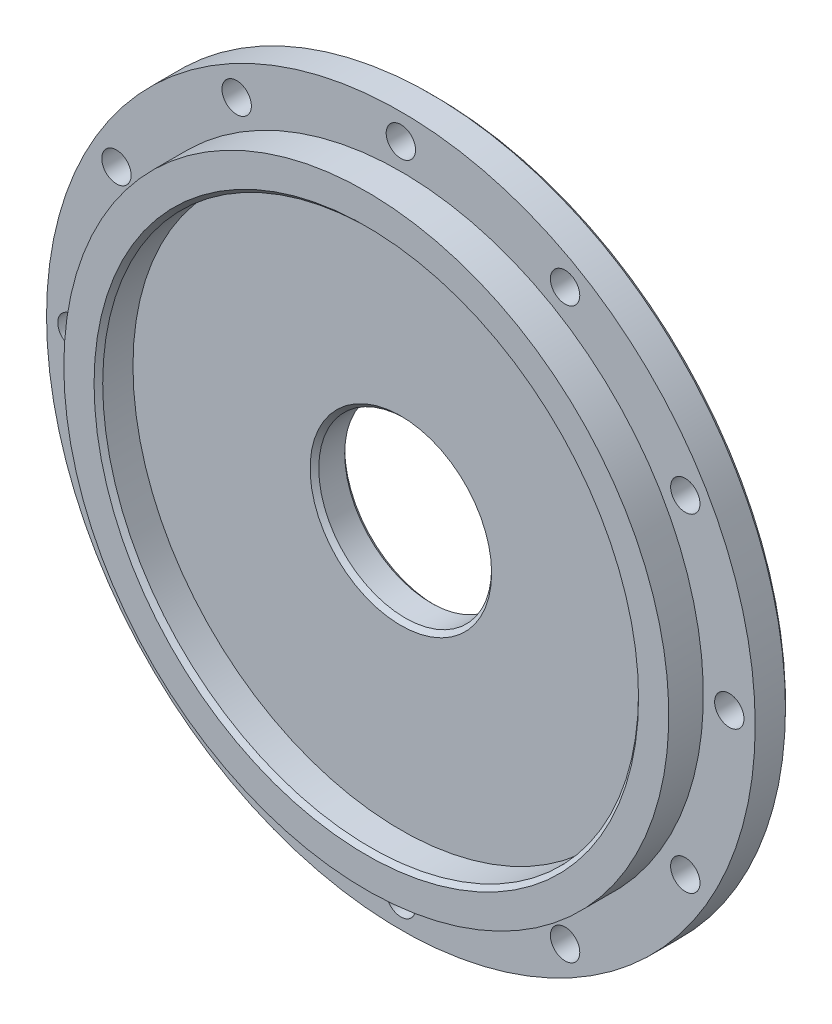
ISO-10303-21;
HEADER;
FILE_DESCRIPTION(('STEP AP214'),'2;1');
FILE_NAME('part.step','',(''),(''),'','','');
FILE_SCHEMA(('AUTOMOTIVE_DESIGN { 1 0 10303 214 1 1 1 1 }'));
ENDSEC;
DATA;
#1=APPLICATION_CONTEXT('core data for automotive mechanical design processes');
#2=APPLICATION_PROTOCOL_DEFINITION('international standard','automotive_design',2000,#1);
#3=PRODUCT_CONTEXT('',#1,'mechanical');
#4=PRODUCT('Part','Part','',(#3));
#5=PRODUCT_RELATED_PRODUCT_CATEGORY('part','',(#4));
#6=PRODUCT_DEFINITION_FORMATION('','',#4);
#7=PRODUCT_DEFINITION_CONTEXT('part definition',#1,'design');
#8=PRODUCT_DEFINITION('design','',#6,#7);
#9=PRODUCT_DEFINITION_SHAPE('','',#8);
#10=(LENGTH_UNIT() NAMED_UNIT(*) SI_UNIT(.MILLI.,.METRE.));
#11=(NAMED_UNIT(*) PLANE_ANGLE_UNIT() SI_UNIT($,.RADIAN.));
#12=(NAMED_UNIT(*) SI_UNIT($,.STERADIAN.) SOLID_ANGLE_UNIT());
#13=UNCERTAINTY_MEASURE_WITH_UNIT(LENGTH_MEASURE(1.E-05),#10,'distance_accuracy_value','');
#14=(GEOMETRIC_REPRESENTATION_CONTEXT(3) GLOBAL_UNCERTAINTY_ASSIGNED_CONTEXT((#13)) GLOBAL_UNIT_ASSIGNED_CONTEXT((#10,
#11,#12)) REPRESENTATION_CONTEXT('',''));
#15=CARTESIAN_POINT('',(0.,0.,0.));
#16=DIRECTION('',(0.,0.,1.));
#17=DIRECTION('',(1.,0.,0.));
#18=AXIS2_PLACEMENT_3D('',#15,#16,#17);
#19=CARTESIAN_POINT('',(0.,0.,0.));
#20=DIRECTION('',(0.,0.,-1.));
#21=DIRECTION('',(-1.,0.,0.));
#22=AXIS2_PLACEMENT_3D('',#19,#20,#21);
#23=PLANE('',#22);
#24=CARTESIAN_POINT('',(0.,0.,0.));
#25=DIRECTION('',(0.,0.,-1.));
#26=DIRECTION('',(-1.,0.,0.));
#27=AXIS2_PLACEMENT_3D('',#24,#25,#26);
#28=CIRCLE('',#27,10.5);
#29=CARTESIAN_POINT('',(-10.5,0.,0.));
#30=VERTEX_POINT('',#29);
#31=EDGE_CURVE('E61',#30,#30,#28,.F.);
#32=ORIENTED_EDGE('',*,*,#31,.T.);
#33=EDGE_LOOP('',(#32));
#34=FACE_BOUND('',#33,.T.);
#35=CARTESIAN_POINT('',(0.,0.,0.));
#36=DIRECTION('',(0.,0.,-1.));
#37=DIRECTION('',(-1.,0.,0.));
#38=AXIS2_PLACEMENT_3D('',#35,#36,#37);
#39=CIRCLE('',#38,40.5);
#40=CARTESIAN_POINT('',(-40.5,0.,0.));
#41=VERTEX_POINT('',#40);
#42=EDGE_CURVE('E62',#41,#41,#39,.T.);
#43=ORIENTED_EDGE('',*,*,#42,.T.);
#44=EDGE_LOOP('',(#43));
#45=FACE_BOUND('',#44,.T.);
#46=CARTESIAN_POINT('',(0.,38.,0.));
#47=DIRECTION('',(0.,0.,-1.));
#48=DIRECTION('',(-1.,0.,0.));
#49=AXIS2_PLACEMENT_3D('',#46,#47,#48);
#50=CIRCLE('',#49,1.7);
#51=CARTESIAN_POINT('',(-1.7,38.,0.));
#52=VERTEX_POINT('',#51);
#53=EDGE_CURVE('E115',#52,#52,#50,.F.);
#54=ORIENTED_EDGE('',*,*,#53,.T.);
#55=EDGE_LOOP('',(#54));
#56=FACE_BOUND('',#55,.T.);
#57=CARTESIAN_POINT('',(-18.9999999999996,32.9089653438089,0.));
#58=DIRECTION('',(0.,0.,-1.));
#59=DIRECTION('',(-1.,0.,0.));
#60=AXIS2_PLACEMENT_3D('',#57,#58,#59);
#61=CIRCLE('',#60,1.7);
#62=CARTESIAN_POINT('',(-20.6999999999996,32.9089653438089,0.));
#63=VERTEX_POINT('',#62);
#64=EDGE_CURVE('E140',#63,#63,#61,.F.);
#65=ORIENTED_EDGE('',*,*,#64,.T.);
#66=EDGE_LOOP('',(#65));
#67=FACE_BOUND('',#66,.T.);
#68=CARTESIAN_POINT('',(-32.9089653438084,19.0000000000004,0.));
#69=DIRECTION('',(0.,0.,-1.));
#70=DIRECTION('',(-1.,0.,0.));
#71=AXIS2_PLACEMENT_3D('',#68,#69,#70);
#72=CIRCLE('',#71,1.7);
#73=CARTESIAN_POINT('',(-34.6089653438084,19.0000000000004,0.));
#74=VERTEX_POINT('',#73);
#75=EDGE_CURVE('E148',#74,#74,#72,.F.);
#76=ORIENTED_EDGE('',*,*,#75,.T.);
#77=EDGE_LOOP('',(#76));
#78=FACE_BOUND('',#77,.T.);
#79=CARTESIAN_POINT('',(-38.,3.98028872628117E-13,0.));
#80=DIRECTION('',(0.,0.,-1.));
#81=DIRECTION('',(-1.,0.,0.));
#82=AXIS2_PLACEMENT_3D('',#79,#80,#81);
#83=CIRCLE('',#82,1.7);
#84=CARTESIAN_POINT('',(-39.7,3.98028872628117E-13,0.));
#85=VERTEX_POINT('',#84);
#86=EDGE_CURVE('E116',#85,#85,#83,.F.);
#87=ORIENTED_EDGE('',*,*,#86,.T.);
#88=EDGE_LOOP('',(#87));
#89=FACE_BOUND('',#88,.T.);
#90=CARTESIAN_POINT('',(19.,32.9089653438087,0.));
#91=DIRECTION('',(0.,0.,-1.));
#92=DIRECTION('',(-1.,0.,0.));
#93=AXIS2_PLACEMENT_3D('',#90,#91,#92);
#94=CIRCLE('',#93,1.7);
#95=CARTESIAN_POINT('',(17.3,32.9089653438087,0.));
#96=VERTEX_POINT('',#95);
#97=EDGE_CURVE('E108',#96,#96,#94,.F.);
#98=ORIENTED_EDGE('',*,*,#97,.T.);
#99=EDGE_LOOP('',(#98));
#100=FACE_BOUND('',#99,.T.);
#101=CARTESIAN_POINT('',(32.9089653438087,18.9999999999999,0.));
#102=DIRECTION('',(0.,0.,-1.));
#103=DIRECTION('',(-1.,0.,0.));
#104=AXIS2_PLACEMENT_3D('',#101,#102,#103);
#105=CIRCLE('',#104,1.70000000000001);
#106=CARTESIAN_POINT('',(31.2089653438087,18.9999999999999,0.));
#107=VERTEX_POINT('',#106);
#108=EDGE_CURVE('E103',#107,#107,#105,.F.);
#109=ORIENTED_EDGE('',*,*,#108,.T.);
#110=EDGE_LOOP('',(#109));
#111=FACE_BOUND('',#110,.T.);
#112=CARTESIAN_POINT('',(38.,-1.32676290876039E-13,0.));
#113=DIRECTION('',(0.,0.,-1.));
#114=DIRECTION('',(-1.,0.,0.));
#115=AXIS2_PLACEMENT_3D('',#112,#113,#114);
#116=CIRCLE('',#115,1.7);
#117=CARTESIAN_POINT('',(36.3,-1.32676290876039E-13,0.));
#118=VERTEX_POINT('',#117);
#119=EDGE_CURVE('E100',#118,#118,#116,.F.);
#120=ORIENTED_EDGE('',*,*,#119,.T.);
#121=EDGE_LOOP('',(#120));
#122=FACE_BOUND('',#121,.T.);
#123=CARTESIAN_POINT('',(32.9089653438086,-19.0000000000002,0.));
#124=DIRECTION('',(0.,0.,-1.));
#125=DIRECTION('',(-1.,0.,0.));
#126=AXIS2_PLACEMENT_3D('',#123,#124,#125);
#127=CIRCLE('',#126,1.7);
#128=CARTESIAN_POINT('',(31.2089653438086,-19.0000000000002,0.));
#129=VERTEX_POINT('',#128);
#130=EDGE_CURVE('E89',#129,#129,#127,.F.);
#131=ORIENTED_EDGE('',*,*,#130,.T.);
#132=EDGE_LOOP('',(#131));
#133=FACE_BOUND('',#132,.T.);
#134=CARTESIAN_POINT('',(18.9999999999998,-32.9089653438088,0.));
#135=DIRECTION('',(0.,0.,-1.));
#136=DIRECTION('',(-1.,0.,0.));
#137=AXIS2_PLACEMENT_3D('',#134,#135,#136);
#138=CIRCLE('',#137,1.7);
#139=CARTESIAN_POINT('',(17.2999999999998,-32.9089653438088,0.));
#140=VERTEX_POINT('',#139);
#141=EDGE_CURVE('E93',#140,#140,#138,.F.);
#142=ORIENTED_EDGE('',*,*,#141,.T.);
#143=EDGE_LOOP('',(#142));
#144=FACE_BOUND('',#143,.T.);
#145=CARTESIAN_POINT('',(-2.65352581752078E-13,-38.,0.));
#146=DIRECTION('',(0.,0.,-1.));
#147=DIRECTION('',(-1.,0.,0.));
#148=AXIS2_PLACEMENT_3D('',#145,#146,#147);
#149=CIRCLE('',#148,1.7);
#150=CARTESIAN_POINT('',(-1.70000000000026,-38.,0.));
#151=VERTEX_POINT('',#150);
#152=EDGE_CURVE('E129',#151,#151,#149,.F.);
#153=ORIENTED_EDGE('',*,*,#152,.T.);
#154=EDGE_LOOP('',(#153));
#155=FACE_BOUND('',#154,.T.);
#156=CARTESIAN_POINT('',(-19.0000000000003,-32.9089653438085,0.));
#157=DIRECTION('',(0.,0.,-1.));
#158=DIRECTION('',(-1.,0.,0.));
#159=AXIS2_PLACEMENT_3D('',#156,#157,#158);
#160=CIRCLE('',#159,1.7);
#161=CARTESIAN_POINT('',(-20.7000000000003,-32.9089653438085,0.));
#162=VERTEX_POINT('',#161);
#163=EDGE_CURVE('E124',#162,#162,#160,.F.);
#164=ORIENTED_EDGE('',*,*,#163,.T.);
#165=EDGE_LOOP('',(#164));
#166=FACE_BOUND('',#165,.T.);
#167=CARTESIAN_POINT('',(-32.9089653438088,-18.9999999999997,0.));
#168=DIRECTION('',(0.,0.,-1.));
#169=DIRECTION('',(-1.,0.,0.));
#170=AXIS2_PLACEMENT_3D('',#167,#168,#169);
#171=CIRCLE('',#170,1.7);
#172=CARTESIAN_POINT('',(-34.6089653438088,-18.9999999999997,0.));
#173=VERTEX_POINT('',#172);
#174=EDGE_CURVE('E119',#173,#173,#171,.F.);
#175=ORIENTED_EDGE('',*,*,#174,.T.);
#176=EDGE_LOOP('',(#175));
#177=FACE_BOUND('',#176,.T.);
#178=ADVANCED_FACE('F41',(#34,#45,#56,#67,#78,#89,#100,#111,#122,#133,#144,#155,#166,#177),#23,.T.);
#179=CARTESIAN_POINT('',(0.,0.,0.));
#180=DIRECTION('',(0.,0.,-1.));
#181=DIRECTION('',(-1.,0.,0.));
#182=AXIS2_PLACEMENT_3D('',#179,#180,#181);
#183=CYLINDRICAL_SURFACE('',#182,41.);
#184=CARTESIAN_POINT('',(0.,0.,0.49999999999998));
#185=DIRECTION('',(0.,0.,-1.));
#186=DIRECTION('',(-1.,0.,0.));
#187=AXIS2_PLACEMENT_3D('',#184,#185,#186);
#188=CIRCLE('',#187,41.);
#189=CARTESIAN_POINT('',(-41.,0.,0.49999999999998));
#190=VERTEX_POINT('',#189);
#191=EDGE_CURVE('E60',#190,#190,#188,.F.);
#192=ORIENTED_EDGE('',*,*,#191,.T.);
#193=EDGE_LOOP('',(#192));
#194=FACE_BOUND('',#193,.T.);
#195=CARTESIAN_POINT('',(0.,0.,4.));
#196=DIRECTION('',(0.,0.,-1.));
#197=DIRECTION('',(-1.,0.,0.));
#198=AXIS2_PLACEMENT_3D('',#195,#196,#197);
#199=CIRCLE('',#198,41.);
#200=CARTESIAN_POINT('',(-41.,0.,4.));
#201=VERTEX_POINT('',#200);
#202=EDGE_CURVE('E74',#201,#201,#199,.T.);
#203=ORIENTED_EDGE('',*,*,#202,.T.);
#204=EDGE_LOOP('',(#203));
#205=FACE_BOUND('',#204,.T.);
#206=ADVANCED_FACE('F164',(#194,#205),#183,.T.);
#207=CARTESIAN_POINT('',(0.,41.,4.));
#208=DIRECTION('',(0.,0.,1.));
#209=DIRECTION('',(1.,0.,0.));
#210=AXIS2_PLACEMENT_3D('',#207,#208,#209);
#211=PLANE('',#210);
#212=CARTESIAN_POINT('',(0.,38.,4.));
#213=DIRECTION('',(0.,0.,1.));
#214=DIRECTION('',(1.,0.,0.));
#215=AXIS2_PLACEMENT_3D('',#212,#213,#214);
#216=CIRCLE('',#215,1.7);
#217=CARTESIAN_POINT('',(1.7,38.,4.));
#218=VERTEX_POINT('',#217);
#219=EDGE_CURVE('E88',#218,#218,#216,.T.);
#220=ORIENTED_EDGE('',*,*,#219,.F.);
#221=EDGE_LOOP('',(#220));
#222=FACE_BOUND('',#221,.T.);
#223=CARTESIAN_POINT('',(-18.9999999999996,32.9089653438089,4.));
#224=DIRECTION('',(0.,0.,1.));
#225=DIRECTION('',(1.,0.,0.));
#226=AXIS2_PLACEMENT_3D('',#223,#224,#225);
#227=CIRCLE('',#226,1.7);
#228=CARTESIAN_POINT('',(-17.2999999999996,32.9089653438089,4.));
#229=VERTEX_POINT('',#228);
#230=EDGE_CURVE('E137',#229,#229,#227,.T.);
#231=ORIENTED_EDGE('',*,*,#230,.F.);
#232=EDGE_LOOP('',(#231));
#233=FACE_BOUND('',#232,.T.);
#234=CARTESIAN_POINT('',(-32.9089653438084,19.0000000000004,4.));
#235=DIRECTION('',(0.,0.,1.));
#236=DIRECTION('',(1.,0.,0.));
#237=AXIS2_PLACEMENT_3D('',#234,#235,#236);
#238=CIRCLE('',#237,1.7);
#239=CARTESIAN_POINT('',(-31.2089653438084,19.0000000000004,4.));
#240=VERTEX_POINT('',#239);
#241=EDGE_CURVE('E141',#240,#240,#238,.T.);
#242=ORIENTED_EDGE('',*,*,#241,.F.);
#243=EDGE_LOOP('',(#242));
#244=FACE_BOUND('',#243,.T.);
#245=CARTESIAN_POINT('',(-38.,3.98028872628117E-13,4.));
#246=DIRECTION('',(0.,0.,1.));
#247=DIRECTION('',(1.,0.,0.));
#248=AXIS2_PLACEMENT_3D('',#245,#246,#247);
#249=CIRCLE('',#248,1.7);
#250=CARTESIAN_POINT('',(-36.3,3.98028872628117E-13,4.));
#251=VERTEX_POINT('',#250);
#252=EDGE_CURVE('E149',#251,#251,#249,.T.);
#253=ORIENTED_EDGE('',*,*,#252,.F.);
#254=EDGE_LOOP('',(#253));
#255=FACE_BOUND('',#254,.T.);
#256=CARTESIAN_POINT('',(19.,32.9089653438087,4.));
#257=DIRECTION('',(0.,0.,1.));
#258=DIRECTION('',(1.,0.,0.));
#259=AXIS2_PLACEMENT_3D('',#256,#257,#258);
#260=CIRCLE('',#259,1.7);
#261=CARTESIAN_POINT('',(20.7,32.9089653438087,4.));
#262=VERTEX_POINT('',#261);
#263=EDGE_CURVE('E106',#262,#262,#260,.T.);
#264=ORIENTED_EDGE('',*,*,#263,.F.);
#265=EDGE_LOOP('',(#264));
#266=FACE_BOUND('',#265,.T.);
#267=CARTESIAN_POINT('',(32.9089653438087,18.9999999999999,4.));
#268=DIRECTION('',(0.,0.,1.));
#269=DIRECTION('',(1.,0.,0.));
#270=AXIS2_PLACEMENT_3D('',#267,#268,#269);
#271=CIRCLE('',#270,1.70000000000001);
#272=CARTESIAN_POINT('',(34.6089653438087,18.9999999999999,4.));
#273=VERTEX_POINT('',#272);
#274=EDGE_CURVE('E99',#273,#273,#271,.T.);
#275=ORIENTED_EDGE('',*,*,#274,.F.);
#276=EDGE_LOOP('',(#275));
#277=FACE_BOUND('',#276,.T.);
#278=CARTESIAN_POINT('',(38.,-1.32676290876039E-13,4.));
#279=DIRECTION('',(0.,0.,1.));
#280=DIRECTION('',(1.,0.,0.));
#281=AXIS2_PLACEMENT_3D('',#278,#279,#280);
#282=CIRCLE('',#281,1.7);
#283=CARTESIAN_POINT('',(39.7,-1.32676290876039E-13,4.));
#284=VERTEX_POINT('',#283);
#285=EDGE_CURVE('E94',#284,#284,#282,.T.);
#286=ORIENTED_EDGE('',*,*,#285,.F.);
#287=EDGE_LOOP('',(#286));
#288=FACE_BOUND('',#287,.T.);
#289=CARTESIAN_POINT('',(32.9089653438086,-19.0000000000002,4.));
#290=DIRECTION('',(0.,0.,1.));
#291=DIRECTION('',(1.,0.,0.));
#292=AXIS2_PLACEMENT_3D('',#289,#290,#291);
#293=CIRCLE('',#292,1.7);
#294=CARTESIAN_POINT('',(34.6089653438086,-19.0000000000002,4.));
#295=VERTEX_POINT('',#294);
#296=EDGE_CURVE('E87',#295,#295,#293,.T.);
#297=ORIENTED_EDGE('',*,*,#296,.F.);
#298=EDGE_LOOP('',(#297));
#299=FACE_BOUND('',#298,.T.);
#300=CARTESIAN_POINT('',(18.9999999999998,-32.9089653438088,4.));
#301=DIRECTION('',(0.,0.,1.));
#302=DIRECTION('',(1.,0.,0.));
#303=AXIS2_PLACEMENT_3D('',#300,#301,#302);
#304=CIRCLE('',#303,1.7);
#305=CARTESIAN_POINT('',(20.6999999999998,-32.9089653438088,4.));
#306=VERTEX_POINT('',#305);
#307=EDGE_CURVE('E131',#306,#306,#304,.T.);
#308=ORIENTED_EDGE('',*,*,#307,.F.);
#309=EDGE_LOOP('',(#308));
#310=FACE_BOUND('',#309,.T.);
#311=CARTESIAN_POINT('',(-2.65352581752078E-13,-38.,4.));
#312=DIRECTION('',(0.,0.,1.));
#313=DIRECTION('',(1.,0.,0.));
#314=AXIS2_PLACEMENT_3D('',#311,#312,#313);
#315=CIRCLE('',#314,1.7);
#316=CARTESIAN_POINT('',(1.69999999999973,-38.,4.));
#317=VERTEX_POINT('',#316);
#318=EDGE_CURVE('E127',#317,#317,#315,.T.);
#319=ORIENTED_EDGE('',*,*,#318,.F.);
#320=EDGE_LOOP('',(#319));
#321=FACE_BOUND('',#320,.T.);
#322=CARTESIAN_POINT('',(-19.0000000000003,-32.9089653438085,4.));
#323=DIRECTION('',(0.,0.,1.));
#324=DIRECTION('',(1.,0.,0.));
#325=AXIS2_PLACEMENT_3D('',#322,#323,#324);
#326=CIRCLE('',#325,1.7);
#327=CARTESIAN_POINT('',(-17.3000000000003,-32.9089653438085,4.));
#328=VERTEX_POINT('',#327);
#329=EDGE_CURVE('E117',#328,#328,#326,.T.);
#330=ORIENTED_EDGE('',*,*,#329,.F.);
#331=EDGE_LOOP('',(#330));
#332=FACE_BOUND('',#331,.T.);
#333=CARTESIAN_POINT('',(-32.9089653438088,-18.9999999999997,4.));
#334=DIRECTION('',(0.,0.,1.));
#335=DIRECTION('',(1.,0.,0.));
#336=AXIS2_PLACEMENT_3D('',#333,#334,#335);
#337=CIRCLE('',#336,1.7);
#338=CARTESIAN_POINT('',(-31.2089653438088,-18.9999999999997,4.));
#339=VERTEX_POINT('',#338);
#340=EDGE_CURVE('E114',#339,#339,#337,.T.);
#341=ORIENTED_EDGE('',*,*,#340,.F.);
#342=EDGE_LOOP('',(#341));
#343=FACE_BOUND('',#342,.T.);
#344=CARTESIAN_POINT('',(0.,0.,4.));
#345=DIRECTION('',(0.,0.,-1.));
#346=DIRECTION('',(-1.,0.,0.));
#347=AXIS2_PLACEMENT_3D('',#344,#345,#346);
#348=CIRCLE('',#347,35.);
#349=CARTESIAN_POINT('',(-35.,0.,4.));
#350=VERTEX_POINT('',#349);
#351=EDGE_CURVE('E76',#350,#350,#348,.T.);
#352=ORIENTED_EDGE('',*,*,#351,.T.);
#353=EDGE_LOOP('',(#352));
#354=FACE_BOUND('',#353,.T.);
#355=ORIENTED_EDGE('',*,*,#202,.F.);
#356=EDGE_LOOP('',(#355));
#357=FACE_BOUND('',#356,.T.);
#358=ADVANCED_FACE('F161',(#222,#233,#244,#255,#266,#277,#288,#299,#310,#321,#332,#343,#354,
#357),#211,.T.);
#359=CARTESIAN_POINT('',(0.,0.,0.));
#360=DIRECTION('',(0.,0.,-1.));
#361=DIRECTION('',(-1.,0.,0.));
#362=AXIS2_PLACEMENT_3D('',#359,#360,#361);
#363=CYLINDRICAL_SURFACE('',#362,35.);
#364=CARTESIAN_POINT('',(0.,0.,8.));
#365=DIRECTION('',(0.,0.,-1.));
#366=DIRECTION('',(-1.,0.,0.));
#367=AXIS2_PLACEMENT_3D('',#364,#365,#366);
#368=CIRCLE('',#367,35.);
#369=CARTESIAN_POINT('',(-35.,0.,8.));
#370=VERTEX_POINT('',#369);
#371=EDGE_CURVE('E77',#370,#370,#368,.T.);
#372=ORIENTED_EDGE('',*,*,#371,.T.);
#373=EDGE_LOOP('',(#372));
#374=FACE_BOUND('',#373,.T.);
#375=ORIENTED_EDGE('',*,*,#351,.F.);
#376=EDGE_LOOP('',(#375));
#377=FACE_BOUND('',#376,.T.);
#378=ADVANCED_FACE('F163',(#374,#377),#363,.T.);
#379=CARTESIAN_POINT('',(0.,35.,8.));
#380=DIRECTION('',(0.,0.,1.));
#381=DIRECTION('',(1.,0.,0.));
#382=AXIS2_PLACEMENT_3D('',#379,#380,#381);
#383=PLANE('',#382);
#384=CARTESIAN_POINT('',(0.,0.,8.));
#385=DIRECTION('',(0.,0.,1.));
#386=DIRECTION('',(1.,0.,0.));
#387=AXIS2_PLACEMENT_3D('',#384,#385,#386);
#388=CIRCLE('',#387,31.5);
#389=CARTESIAN_POINT('',(31.5,0.,8.));
#390=VERTEX_POINT('',#389);
#391=EDGE_CURVE('E47',#390,#390,#388,.F.);
#392=ORIENTED_EDGE('',*,*,#391,.T.);
#393=EDGE_LOOP('',(#392));
#394=FACE_BOUND('',#393,.T.);
#395=ORIENTED_EDGE('',*,*,#371,.F.);
#396=EDGE_LOOP('',(#395));
#397=FACE_BOUND('',#396,.T.);
#398=ADVANCED_FACE('F244',(#394,#397),#383,.T.);
#399=CARTESIAN_POINT('',(0.,0.,0.));
#400=DIRECTION('',(0.,0.,-1.));
#401=DIRECTION('',(-1.,0.,0.));
#402=AXIS2_PLACEMENT_3D('',#399,#400,#401);
#403=CYLINDRICAL_SURFACE('',#402,31.);
#404=CARTESIAN_POINT('',(0.,0.,7.5));
#405=DIRECTION('',(0.,0.,1.));
#406=DIRECTION('',(1.,0.,0.));
#407=AXIS2_PLACEMENT_3D('',#404,#405,#406);
#408=CIRCLE('',#407,31.);
#409=CARTESIAN_POINT('',(31.,0.,7.5));
#410=VERTEX_POINT('',#409);
#411=EDGE_CURVE('E10',#410,#410,#408,.T.);
#412=ORIENTED_EDGE('',*,*,#411,.T.);
#413=EDGE_LOOP('',(#412));
#414=FACE_BOUND('',#413,.T.);
#415=CARTESIAN_POINT('',(0.,0.,4.));
#416=DIRECTION('',(0.,0.,-1.));
#417=DIRECTION('',(-1.,0.,0.));
#418=AXIS2_PLACEMENT_3D('',#415,#416,#417);
#419=CIRCLE('',#418,31.);
#420=CARTESIAN_POINT('',(-31.,0.,4.));
#421=VERTEX_POINT('',#420);
#422=EDGE_CURVE('E84',#421,#421,#419,.T.);
#423=ORIENTED_EDGE('',*,*,#422,.T.);
#424=EDGE_LOOP('',(#423));
#425=FACE_BOUND('',#424,.T.);
#426=ADVANCED_FACE('F237',(#414,#425),#403,.F.);
#427=CARTESIAN_POINT('',(0.,31.,4.));
#428=DIRECTION('',(0.,0.,1.));
#429=DIRECTION('',(1.,0.,0.));
#430=AXIS2_PLACEMENT_3D('',#427,#428,#429);
#431=PLANE('',#430);
#432=CARTESIAN_POINT('',(0.,0.,4.));
#433=DIRECTION('',(0.,0.,1.));
#434=DIRECTION('',(1.,0.,0.));
#435=AXIS2_PLACEMENT_3D('',#432,#433,#434);
#436=CIRCLE('',#435,10.5);
#437=CARTESIAN_POINT('',(10.5,0.,4.));
#438=VERTEX_POINT('',#437);
#439=EDGE_CURVE('E52',#438,#438,#436,.F.);
#440=ORIENTED_EDGE('',*,*,#439,.T.);
#441=EDGE_LOOP('',(#440));
#442=FACE_BOUND('',#441,.T.);
#443=ORIENTED_EDGE('',*,*,#422,.F.);
#444=EDGE_LOOP('',(#443));
#445=FACE_BOUND('',#444,.T.);
#446=ADVANCED_FACE('F232',(#442,#445),#431,.T.);
#447=CARTESIAN_POINT('',(-32.9089653438088,-18.9999999999997,-0.00100000000000013));
#448=DIRECTION('',(0.,0.,1.));
#449=DIRECTION('',(1.,0.,0.));
#450=AXIS2_PLACEMENT_3D('',#447,#448,#449);
#451=CYLINDRICAL_SURFACE('',#450,1.7);
#452=ORIENTED_EDGE('',*,*,#174,.F.);
#453=EDGE_LOOP('',(#452));
#454=FACE_BOUND('',#453,.T.);
#455=ORIENTED_EDGE('',*,*,#340,.T.);
#456=EDGE_LOOP('',(#455));
#457=FACE_BOUND('',#456,.T.);
#458=ADVANCED_FACE('F235',(#454,#457),#451,.F.);
#459=CARTESIAN_POINT('',(-19.0000000000003,-32.9089653438085,-0.00100000000000013));
#460=DIRECTION('',(0.,0.,1.));
#461=DIRECTION('',(1.,0.,0.));
#462=AXIS2_PLACEMENT_3D('',#459,#460,#461);
#463=CYLINDRICAL_SURFACE('',#462,1.7);
#464=ORIENTED_EDGE('',*,*,#163,.F.);
#465=EDGE_LOOP('',(#464));
#466=FACE_BOUND('',#465,.T.);
#467=ORIENTED_EDGE('',*,*,#329,.T.);
#468=EDGE_LOOP('',(#467));
#469=FACE_BOUND('',#468,.T.);
#470=ADVANCED_FACE('F270',(#466,#469),#463,.F.);
#471=CARTESIAN_POINT('',(-2.65352581752078E-13,-38.,-0.00100000000000013));
#472=DIRECTION('',(0.,0.,1.));
#473=DIRECTION('',(1.,0.,0.));
#474=AXIS2_PLACEMENT_3D('',#471,#472,#473);
#475=CYLINDRICAL_SURFACE('',#474,1.7);
#476=ORIENTED_EDGE('',*,*,#152,.F.);
#477=EDGE_LOOP('',(#476));
#478=FACE_BOUND('',#477,.T.);
#479=ORIENTED_EDGE('',*,*,#318,.T.);
#480=EDGE_LOOP('',(#479));
#481=FACE_BOUND('',#480,.T.);
#482=ADVANCED_FACE('F280',(#478,#481),#475,.F.);
#483=CARTESIAN_POINT('',(18.9999999999998,-32.9089653438088,-0.00100000000000013));
#484=DIRECTION('',(0.,0.,1.));
#485=DIRECTION('',(1.,0.,0.));
#486=AXIS2_PLACEMENT_3D('',#483,#484,#485);
#487=CYLINDRICAL_SURFACE('',#486,1.7);
#488=ORIENTED_EDGE('',*,*,#141,.F.);
#489=EDGE_LOOP('',(#488));
#490=FACE_BOUND('',#489,.T.);
#491=ORIENTED_EDGE('',*,*,#307,.T.);
#492=EDGE_LOOP('',(#491));
#493=FACE_BOUND('',#492,.T.);
#494=ADVANCED_FACE('F286',(#490,#493),#487,.F.);
#495=CARTESIAN_POINT('',(32.9089653438086,-19.0000000000002,-0.00100000000000013));
#496=DIRECTION('',(0.,0.,1.));
#497=DIRECTION('',(1.,0.,0.));
#498=AXIS2_PLACEMENT_3D('',#495,#496,#497);
#499=CYLINDRICAL_SURFACE('',#498,1.7);
#500=ORIENTED_EDGE('',*,*,#130,.F.);
#501=EDGE_LOOP('',(#500));
#502=FACE_BOUND('',#501,.T.);
#503=ORIENTED_EDGE('',*,*,#296,.T.);
#504=EDGE_LOOP('',(#503));
#505=FACE_BOUND('',#504,.T.);
#506=ADVANCED_FACE('F293',(#502,#505),#499,.F.);
#507=CARTESIAN_POINT('',(38.,-1.32676290876039E-13,-0.00100000000000013));
#508=DIRECTION('',(0.,0.,1.));
#509=DIRECTION('',(1.,0.,0.));
#510=AXIS2_PLACEMENT_3D('',#507,#508,#509);
#511=CYLINDRICAL_SURFACE('',#510,1.7);
#512=ORIENTED_EDGE('',*,*,#119,.F.);
#513=EDGE_LOOP('',(#512));
#514=FACE_BOUND('',#513,.T.);
#515=ORIENTED_EDGE('',*,*,#285,.T.);
#516=EDGE_LOOP('',(#515));
#517=FACE_BOUND('',#516,.T.);
#518=ADVANCED_FACE('F303',(#514,#517),#511,.F.);
#519=CARTESIAN_POINT('',(32.9089653438087,18.9999999999999,-0.00100000000000013));
#520=DIRECTION('',(0.,0.,1.));
#521=DIRECTION('',(1.,0.,0.));
#522=AXIS2_PLACEMENT_3D('',#519,#520,#521);
#523=CYLINDRICAL_SURFACE('',#522,1.70000000000001);
#524=ORIENTED_EDGE('',*,*,#108,.F.);
#525=EDGE_LOOP('',(#524));
#526=FACE_BOUND('',#525,.T.);
#527=ORIENTED_EDGE('',*,*,#274,.T.);
#528=EDGE_LOOP('',(#527));
#529=FACE_BOUND('',#528,.T.);
#530=ADVANCED_FACE('F315',(#526,#529),#523,.F.);
#531=CARTESIAN_POINT('',(19.,32.9089653438087,-0.00100000000000013));
#532=DIRECTION('',(0.,0.,1.));
#533=DIRECTION('',(1.,0.,0.));
#534=AXIS2_PLACEMENT_3D('',#531,#532,#533);
#535=CYLINDRICAL_SURFACE('',#534,1.7);
#536=ORIENTED_EDGE('',*,*,#97,.F.);
#537=EDGE_LOOP('',(#536));
#538=FACE_BOUND('',#537,.T.);
#539=ORIENTED_EDGE('',*,*,#263,.T.);
#540=EDGE_LOOP('',(#539));
#541=FACE_BOUND('',#540,.T.);
#542=ADVANCED_FACE('F321',(#538,#541),#535,.F.);
#543=CARTESIAN_POINT('',(-38.,3.98028872628117E-13,-0.00100000000000013));
#544=DIRECTION('',(0.,0.,1.));
#545=DIRECTION('',(1.,0.,0.));
#546=AXIS2_PLACEMENT_3D('',#543,#544,#545);
#547=CYLINDRICAL_SURFACE('',#546,1.7);
#548=ORIENTED_EDGE('',*,*,#86,.F.);
#549=EDGE_LOOP('',(#548));
#550=FACE_BOUND('',#549,.T.);
#551=ORIENTED_EDGE('',*,*,#252,.T.);
#552=EDGE_LOOP('',(#551));
#553=FACE_BOUND('',#552,.T.);
#554=ADVANCED_FACE('F329',(#550,#553),#547,.F.);
#555=CARTESIAN_POINT('',(-32.9089653438084,19.0000000000004,-0.00100000000000013));
#556=DIRECTION('',(0.,0.,1.));
#557=DIRECTION('',(1.,0.,0.));
#558=AXIS2_PLACEMENT_3D('',#555,#556,#557);
#559=CYLINDRICAL_SURFACE('',#558,1.7);
#560=ORIENTED_EDGE('',*,*,#75,.F.);
#561=EDGE_LOOP('',(#560));
#562=FACE_BOUND('',#561,.T.);
#563=ORIENTED_EDGE('',*,*,#241,.T.);
#564=EDGE_LOOP('',(#563));
#565=FACE_BOUND('',#564,.T.);
#566=ADVANCED_FACE('F338',(#562,#565),#559,.F.);
#567=CARTESIAN_POINT('',(-18.9999999999996,32.9089653438089,-0.00100000000000013));
#568=DIRECTION('',(0.,0.,1.));
#569=DIRECTION('',(1.,0.,0.));
#570=AXIS2_PLACEMENT_3D('',#567,#568,#569);
#571=CYLINDRICAL_SURFACE('',#570,1.7);
#572=ORIENTED_EDGE('',*,*,#64,.F.);
#573=EDGE_LOOP('',(#572));
#574=FACE_BOUND('',#573,.T.);
#575=ORIENTED_EDGE('',*,*,#230,.T.);
#576=EDGE_LOOP('',(#575));
#577=FACE_BOUND('',#576,.T.);
#578=ADVANCED_FACE('F346',(#574,#577),#571,.F.);
#579=CARTESIAN_POINT('',(0.,38.,-0.00100000000000013));
#580=DIRECTION('',(0.,0.,1.));
#581=DIRECTION('',(1.,0.,0.));
#582=AXIS2_PLACEMENT_3D('',#579,#580,#581);
#583=CYLINDRICAL_SURFACE('',#582,1.7);
#584=ORIENTED_EDGE('',*,*,#53,.F.);
#585=EDGE_LOOP('',(#584));
#586=FACE_BOUND('',#585,.T.);
#587=ORIENTED_EDGE('',*,*,#219,.T.);
#588=EDGE_LOOP('',(#587));
#589=FACE_BOUND('',#588,.T.);
#590=ADVANCED_FACE('F157',(#586,#589),#583,.F.);
#591=CARTESIAN_POINT('',(0.,0.,8.001));
#592=DIRECTION('',(0.,0.,-1.));
#593=DIRECTION('',(-1.,0.,0.));
#594=AXIS2_PLACEMENT_3D('',#591,#592,#593);
#595=CYLINDRICAL_SURFACE('',#594,10.);
#596=CARTESIAN_POINT('',(0.,0.,0.500000000000002));
#597=DIRECTION('',(0.,0.,-1.));
#598=DIRECTION('',(-1.,0.,0.));
#599=AXIS2_PLACEMENT_3D('',#596,#597,#598);
#600=CIRCLE('',#599,10.);
#601=CARTESIAN_POINT('',(-10.,0.,0.500000000000002));
#602=VERTEX_POINT('',#601);
#603=EDGE_CURVE('E69',#602,#602,#600,.T.);
#604=ORIENTED_EDGE('',*,*,#603,.T.);
#605=EDGE_LOOP('',(#604));
#606=FACE_BOUND('',#605,.T.);
#607=CARTESIAN_POINT('',(0.,0.,3.5));
#608=DIRECTION('',(0.,0.,1.));
#609=DIRECTION('',(1.,0.,0.));
#610=AXIS2_PLACEMENT_3D('',#607,#608,#609);
#611=CIRCLE('',#610,10.);
#612=CARTESIAN_POINT('',(10.,0.,3.5));
#613=VERTEX_POINT('',#612);
#614=EDGE_CURVE('E72',#613,#613,#611,.T.);
#615=ORIENTED_EDGE('',*,*,#614,.T.);
#616=EDGE_LOOP('',(#615));
#617=FACE_BOUND('',#616,.T.);
#618=ADVANCED_FACE('F215',(#606,#617),#595,.F.);
#619=CARTESIAN_POINT('',(0.,0.,0.500000000000002));
#620=DIRECTION('',(0.,0.,-1.));
#621=DIRECTION('',(-1.,0.,0.));
#622=AXIS2_PLACEMENT_3D('',#619,#620,#621);
#623=CONICAL_SURFACE('',#622,10.,0.785398163397441);
#624=ORIENTED_EDGE('',*,*,#31,.F.);
#625=EDGE_LOOP('',(#624));
#626=FACE_BOUND('',#625,.T.);
#627=ORIENTED_EDGE('',*,*,#603,.F.);
#628=EDGE_LOOP('',(#627));
#629=FACE_BOUND('',#628,.T.);
#630=ADVANCED_FACE('F202',(#626,#629),#623,.F.);
#631=CARTESIAN_POINT('',(0.,0.,0.));
#632=DIRECTION('',(0.,0.,1.));
#633=DIRECTION('',(1.,0.,0.));
#634=AXIS2_PLACEMENT_3D('',#631,#632,#633);
#635=CONICAL_SURFACE('',#634,40.5,0.785398163397448);
#636=ORIENTED_EDGE('',*,*,#191,.F.);
#637=EDGE_LOOP('',(#636));
#638=FACE_BOUND('',#637,.T.);
#639=ORIENTED_EDGE('',*,*,#42,.F.);
#640=EDGE_LOOP('',(#639));
#641=FACE_BOUND('',#640,.T.);
#642=ADVANCED_FACE('F211',(#638,#641),#635,.T.);
#643=CARTESIAN_POINT('',(0.,0.,4.));
#644=DIRECTION('',(0.,0.,1.));
#645=DIRECTION('',(1.,0.,0.));
#646=AXIS2_PLACEMENT_3D('',#643,#644,#645);
#647=CONICAL_SURFACE('',#646,10.5,0.785398163397455);
#648=ORIENTED_EDGE('',*,*,#614,.F.);
#649=EDGE_LOOP('',(#648));
#650=FACE_BOUND('',#649,.T.);
#651=ORIENTED_EDGE('',*,*,#439,.F.);
#652=EDGE_LOOP('',(#651));
#653=FACE_BOUND('',#652,.T.);
#654=ADVANCED_FACE('F217',(#650,#653),#647,.F.);
#655=CARTESIAN_POINT('',(0.,0.,8.));
#656=DIRECTION('',(0.,0.,1.));
#657=DIRECTION('',(1.,0.,0.));
#658=AXIS2_PLACEMENT_3D('',#655,#656,#657);
#659=CONICAL_SURFACE('',#658,31.5,0.785398163397434);
#660=ORIENTED_EDGE('',*,*,#411,.F.);
#661=EDGE_LOOP('',(#660));
#662=FACE_BOUND('',#661,.T.);
#663=ORIENTED_EDGE('',*,*,#391,.F.);
#664=EDGE_LOOP('',(#663));
#665=FACE_BOUND('',#664,.T.);
#666=ADVANCED_FACE('F42',(#662,#665),#659,.F.);
#667=CLOSED_SHELL('',(#178,#206,#358,#378,#398,#426,#446,#458,#470,#482,#494,#506,#518,#530,
#542,#554,#566,#578,#590,#618,#630,#642,#654,#666));
#668=MANIFOLD_SOLID_BREP('B2',#667);
#669=ADVANCED_BREP_SHAPE_REPRESENTATION('',(#18,#668),#14);
#670=SHAPE_DEFINITION_REPRESENTATION(#9,#669);
ENDSEC;
END-ISO-10303-21;
